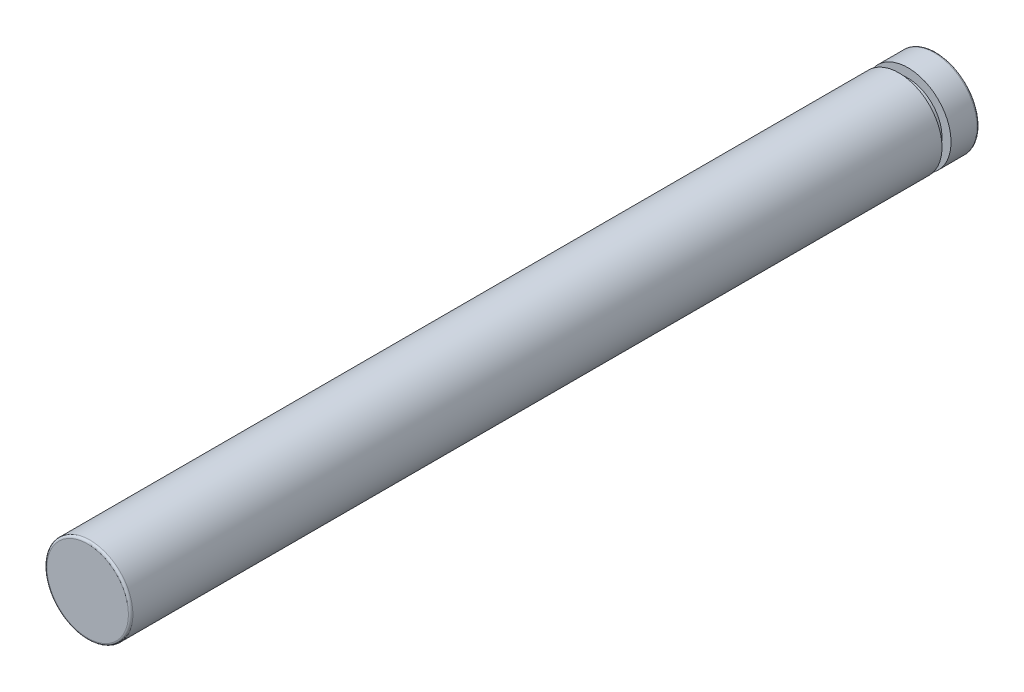
ISO-10303-21;
HEADER;
FILE_DESCRIPTION(('STEP AP214'),'2;1');
FILE_NAME('part.step','',(''),(''),'','','');
FILE_SCHEMA(('AUTOMOTIVE_DESIGN { 1 0 10303 214 1 1 1 1 }'));
ENDSEC;
DATA;
#1=APPLICATION_CONTEXT('core data for automotive mechanical design processes');
#2=APPLICATION_PROTOCOL_DEFINITION('international standard','automotive_design',2000,#1);
#3=PRODUCT_CONTEXT('',#1,'mechanical');
#4=PRODUCT('Part','Part','',(#3));
#5=PRODUCT_RELATED_PRODUCT_CATEGORY('part','',(#4));
#6=PRODUCT_DEFINITION_FORMATION('','',#4);
#7=PRODUCT_DEFINITION_CONTEXT('part definition',#1,'design');
#8=PRODUCT_DEFINITION('design','',#6,#7);
#9=PRODUCT_DEFINITION_SHAPE('','',#8);
#10=(LENGTH_UNIT() NAMED_UNIT(*) SI_UNIT(.MILLI.,.METRE.));
#11=(NAMED_UNIT(*) PLANE_ANGLE_UNIT() SI_UNIT($,.RADIAN.));
#12=(NAMED_UNIT(*) SI_UNIT($,.STERADIAN.) SOLID_ANGLE_UNIT());
#13=UNCERTAINTY_MEASURE_WITH_UNIT(LENGTH_MEASURE(1.E-05),#10,'distance_accuracy_value','');
#14=(GEOMETRIC_REPRESENTATION_CONTEXT(3) GLOBAL_UNCERTAINTY_ASSIGNED_CONTEXT((#13)) GLOBAL_UNIT_ASSIGNED_CONTEXT((#10,
#11,#12)) REPRESENTATION_CONTEXT('',''));
#15=CARTESIAN_POINT('',(0.,0.,0.));
#16=DIRECTION('',(0.,0.,1.));
#17=DIRECTION('',(1.,0.,0.));
#18=AXIS2_PLACEMENT_3D('',#15,#16,#17);
#19=CARTESIAN_POINT('',(0.,0.,47.625));
#20=DIRECTION('',(0.,0.,-1.));
#21=DIRECTION('',(-1.,0.,0.));
#22=AXIS2_PLACEMENT_3D('',#19,#20,#21);
#23=CYLINDRICAL_SURFACE('',#22,4.826);
#24=CARTESIAN_POINT('',(0.,0.,47.371));
#25=DIRECTION('',(0.,0.,1.));
#26=DIRECTION('',(1.,0.,0.));
#27=AXIS2_PLACEMENT_3D('',#24,#25,#26);
#28=CIRCLE('',#27,4.826);
#29=CARTESIAN_POINT('',(4.826,0.,47.371));
#30=VERTEX_POINT('',#29);
#31=EDGE_CURVE('E42',#30,#30,#28,.F.);
#32=ORIENTED_EDGE('',*,*,#31,.T.);
#33=EDGE_LOOP('',(#32));
#34=FACE_BOUND('',#33,.T.);
#35=CARTESIAN_POINT('',(0.,0.,-43.434));
#36=DIRECTION('',(0.,0.,-1.));
#37=DIRECTION('',(-1.,0.,0.));
#38=AXIS2_PLACEMENT_3D('',#35,#36,#37);
#39=CIRCLE('',#38,4.826);
#40=CARTESIAN_POINT('',(-4.826,0.,-43.434));
#41=VERTEX_POINT('',#40);
#42=EDGE_CURVE('E51',#41,#41,#39,.T.);
#43=ORIENTED_EDGE('',*,*,#42,.F.);
#44=EDGE_LOOP('',(#43));
#45=FACE_BOUND('',#44,.T.);
#46=ADVANCED_FACE('F31',(#34,#45),#23,.T.);
#47=CARTESIAN_POINT('',(0.,0.,47.625));
#48=DIRECTION('',(0.,0.,1.));
#49=DIRECTION('',(1.,0.,0.));
#50=AXIS2_PLACEMENT_3D('',#47,#48,#49);
#51=PLANE('',#50);
#52=CARTESIAN_POINT('',(0.,0.,47.625));
#53=DIRECTION('',(0.,0.,1.));
#54=DIRECTION('',(1.,0.,0.));
#55=AXIS2_PLACEMENT_3D('',#52,#53,#54);
#56=CIRCLE('',#55,4.572);
#57=CARTESIAN_POINT('',(4.572,0.,47.625));
#58=VERTEX_POINT('',#57);
#59=EDGE_CURVE('E46',#58,#58,#56,.T.);
#60=ORIENTED_EDGE('',*,*,#59,.T.);
#61=EDGE_LOOP('',(#60));
#62=FACE_BOUND('',#61,.T.);
#63=ADVANCED_FACE('F82',(#62),#51,.T.);
#64=CARTESIAN_POINT('',(-4.826,0.,-43.434));
#65=DIRECTION('',(0.,0.,1.));
#66=DIRECTION('',(1.,0.,0.));
#67=AXIS2_PLACEMENT_3D('',#64,#65,#66);
#68=PLANE('',#67);
#69=CARTESIAN_POINT('',(0.,0.,-43.434));
#70=DIRECTION('',(0.,0.,-1.));
#71=DIRECTION('',(-1.,0.,0.));
#72=AXIS2_PLACEMENT_3D('',#69,#70,#71);
#73=CIRCLE('',#72,3.81);
#74=CARTESIAN_POINT('',(-3.81,0.,-43.434));
#75=VERTEX_POINT('',#74);
#76=EDGE_CURVE('E54',#75,#75,#73,.T.);
#77=ORIENTED_EDGE('',*,*,#76,.F.);
#78=EDGE_LOOP('',(#77));
#79=FACE_BOUND('',#78,.T.);
#80=ORIENTED_EDGE('',*,*,#42,.T.);
#81=EDGE_LOOP('',(#80));
#82=FACE_BOUND('',#81,.T.);
#83=ADVANCED_FACE('F76',(#79,#82),#68,.F.);
#84=CARTESIAN_POINT('',(0.,0.,-52.0123671314601));
#85=DIRECTION('',(0.,0.,-1.));
#86=DIRECTION('',(-1.,0.,0.));
#87=AXIS2_PLACEMENT_3D('',#84,#85,#86);
#88=CYLINDRICAL_SURFACE('',#87,3.81);
#89=CARTESIAN_POINT('',(0.,0.,-44.45));
#90=DIRECTION('',(0.,0.,-1.));
#91=DIRECTION('',(-1.,0.,0.));
#92=AXIS2_PLACEMENT_3D('',#89,#90,#91);
#93=CIRCLE('',#92,3.81);
#94=CARTESIAN_POINT('',(-3.81,0.,-44.45));
#95=VERTEX_POINT('',#94);
#96=EDGE_CURVE('E57',#95,#95,#93,.T.);
#97=ORIENTED_EDGE('',*,*,#96,.F.);
#98=EDGE_LOOP('',(#97));
#99=FACE_BOUND('',#98,.T.);
#100=ORIENTED_EDGE('',*,*,#76,.T.);
#101=EDGE_LOOP('',(#100));
#102=FACE_BOUND('',#101,.T.);
#103=ADVANCED_FACE('F70',(#99,#102),#88,.T.);
#104=CARTESIAN_POINT('',(-4.826,0.,-44.45));
#105=DIRECTION('',(0.,0.,-1.));
#106=DIRECTION('',(-1.,0.,0.));
#107=AXIS2_PLACEMENT_3D('',#104,#105,#106);
#108=PLANE('',#107);
#109=CARTESIAN_POINT('',(0.,0.,-44.45));
#110=DIRECTION('',(0.,0.,-1.));
#111=DIRECTION('',(-1.,0.,0.));
#112=AXIS2_PLACEMENT_3D('',#109,#110,#111);
#113=CIRCLE('',#112,4.826);
#114=CARTESIAN_POINT('',(-4.826,0.,-44.45));
#115=VERTEX_POINT('',#114);
#116=EDGE_CURVE('E60',#115,#115,#113,.T.);
#117=ORIENTED_EDGE('',*,*,#116,.F.);
#118=EDGE_LOOP('',(#117));
#119=FACE_BOUND('',#118,.T.);
#120=ORIENTED_EDGE('',*,*,#96,.T.);
#121=EDGE_LOOP('',(#120));
#122=FACE_BOUND('',#121,.T.);
#123=ADVANCED_FACE('F66',(#119,#122),#108,.F.);
#124=CARTESIAN_POINT('',(0.,0.,-47.625));
#125=DIRECTION('',(0.,0.,1.));
#126=DIRECTION('',(1.,0.,0.));
#127=AXIS2_PLACEMENT_3D('',#124,#125,#126);
#128=PLANE('',#127);
#129=CARTESIAN_POINT('',(0.,0.,-47.625));
#130=DIRECTION('',(0.,0.,1.));
#131=DIRECTION('',(1.,0.,0.));
#132=AXIS2_PLACEMENT_3D('',#129,#130,#131);
#133=CIRCLE('',#132,4.572);
#134=CARTESIAN_POINT('',(4.572,0.,-47.625));
#135=VERTEX_POINT('',#134);
#136=EDGE_CURVE('E10',#135,#135,#133,.F.);
#137=ORIENTED_EDGE('',*,*,#136,.T.);
#138=EDGE_LOOP('',(#137));
#139=FACE_BOUND('',#138,.T.);
#140=ADVANCED_FACE('F69',(#139),#128,.F.);
#141=CARTESIAN_POINT('',(0.,0.,-47.371));
#142=DIRECTION('',(0.,0.,1.));
#143=DIRECTION('',(1.,0.,0.));
#144=AXIS2_PLACEMENT_3D('',#141,#142,#143);
#145=CIRCLE('',#144,4.826);
#146=CARTESIAN_POINT('',(4.826,0.,-47.371));
#147=VERTEX_POINT('',#146);
#148=EDGE_CURVE('E38',#147,#147,#145,.T.);
#149=ORIENTED_EDGE('',*,*,#148,.T.);
#150=EDGE_LOOP('',(#149));
#151=FACE_BOUND('',#150,.T.);
#152=ORIENTED_EDGE('',*,*,#116,.T.);
#153=EDGE_LOOP('',(#152));
#154=FACE_BOUND('',#153,.T.);
#155=ADVANCED_FACE('F64',(#151,#154),#23,.T.);
#156=CARTESIAN_POINT('',(0.,0.,47.371));
#157=DIRECTION('',(0.,0.,1.));
#158=DIRECTION('',(1.,0.,0.));
#159=AXIS2_PLACEMENT_3D('',#156,#157,#158);
#160=TOROIDAL_SURFACE('',#159,4.572,0.254);
#161=ORIENTED_EDGE('',*,*,#31,.F.);
#162=EDGE_LOOP('',(#161));
#163=FACE_BOUND('',#162,.T.);
#164=ORIENTED_EDGE('',*,*,#59,.F.);
#165=EDGE_LOOP('',(#164));
#166=FACE_BOUND('',#165,.T.);
#167=ADVANCED_FACE('F97',(#163,#166),#160,.T.);
#168=CARTESIAN_POINT('',(0.,0.,-47.371));
#169=DIRECTION('',(0.,0.,1.));
#170=DIRECTION('',(1.,0.,0.));
#171=AXIS2_PLACEMENT_3D('',#168,#169,#170);
#172=TOROIDAL_SURFACE('',#171,4.572,0.254);
#173=ORIENTED_EDGE('',*,*,#136,.F.);
#174=EDGE_LOOP('',(#173));
#175=FACE_BOUND('',#174,.T.);
#176=ORIENTED_EDGE('',*,*,#148,.F.);
#177=EDGE_LOOP('',(#176));
#178=FACE_BOUND('',#177,.T.);
#179=ADVANCED_FACE('F33',(#175,#178),#172,.T.);
#180=CLOSED_SHELL('',(#46,#63,#83,#103,#123,#140,#155,#167,#179));
#181=MANIFOLD_SOLID_BREP('B2',#180);
#182=ADVANCED_BREP_SHAPE_REPRESENTATION('',(#18,#181),#14);
#183=SHAPE_DEFINITION_REPRESENTATION(#9,#182);
ENDSEC;
END-ISO-10303-21;
